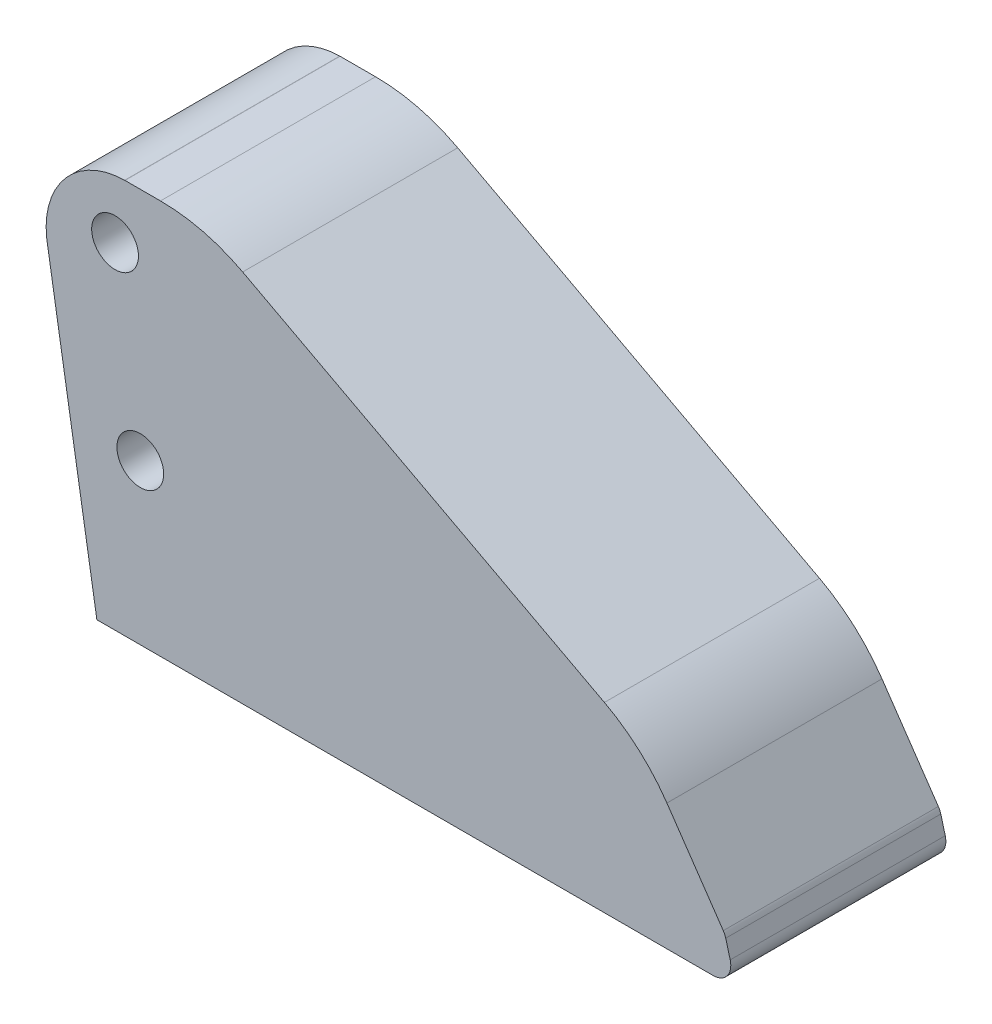
ISO-10303-21;
HEADER;
FILE_DESCRIPTION(('STEP AP214'),'2;1');
FILE_NAME('part.step','',(''),(''),'','','');
FILE_SCHEMA(('AUTOMOTIVE_DESIGN { 1 0 10303 214 1 1 1 1 }'));
ENDSEC;
DATA;
#1=APPLICATION_CONTEXT('core data for automotive mechanical design processes');
#2=APPLICATION_PROTOCOL_DEFINITION('international standard','automotive_design',2000,#1);
#3=PRODUCT_CONTEXT('',#1,'mechanical');
#4=PRODUCT('Part','Part','',(#3));
#5=PRODUCT_RELATED_PRODUCT_CATEGORY('part','',(#4));
#6=PRODUCT_DEFINITION_FORMATION('','',#4);
#7=PRODUCT_DEFINITION_CONTEXT('part definition',#1,'design');
#8=PRODUCT_DEFINITION('design','',#6,#7);
#9=PRODUCT_DEFINITION_SHAPE('','',#8);
#10=(LENGTH_UNIT() NAMED_UNIT(*) SI_UNIT(.MILLI.,.METRE.));
#11=(NAMED_UNIT(*) PLANE_ANGLE_UNIT() SI_UNIT($,.RADIAN.));
#12=(NAMED_UNIT(*) SI_UNIT($,.STERADIAN.) SOLID_ANGLE_UNIT());
#13=UNCERTAINTY_MEASURE_WITH_UNIT(LENGTH_MEASURE(1.E-05),#10,'distance_accuracy_value','');
#14=(GEOMETRIC_REPRESENTATION_CONTEXT(3) GLOBAL_UNCERTAINTY_ASSIGNED_CONTEXT((#13)) GLOBAL_UNIT_ASSIGNED_CONTEXT((#10,
#11,#12)) REPRESENTATION_CONTEXT('',''));
#15=CARTESIAN_POINT('',(0.,0.,0.));
#16=DIRECTION('',(0.,0.,1.));
#17=DIRECTION('',(1.,0.,0.));
#18=AXIS2_PLACEMENT_3D('',#15,#16,#17);
#19=CARTESIAN_POINT('',(14.7218848199657,32.6719265465916,31.28));
#20=DIRECTION('',(0.,0.,-1.));
#21=DIRECTION('',(-1.,0.,0.));
#22=AXIS2_PLACEMENT_3D('',#19,#20,#21);
#23=CYLINDRICAL_SURFACE('',#22,2.8);
#24=CARTESIAN_POINT('',(14.7218848199657,32.6719265465916,31.28));
#25=DIRECTION('',(0.,0.,1.));
#26=DIRECTION('',(1.,0.,0.));
#27=AXIS2_PLACEMENT_3D('',#24,#25,#26);
#28=CIRCLE('',#27,2.8);
#29=CARTESIAN_POINT('',(17.5218848199657,32.6719265465916,31.28));
#30=VERTEX_POINT('',#29);
#31=EDGE_CURVE('E459',#30,#30,#28,.T.);
#32=ORIENTED_EDGE('',*,*,#31,.T.);
#33=EDGE_LOOP('',(#32));
#34=FACE_BOUND('',#33,.T.);
#35=CARTESIAN_POINT('',(14.7218848199657,32.6719265465916,5.52));
#36=DIRECTION('',(0.,0.,1.));
#37=DIRECTION('',(1.,0.,0.));
#38=AXIS2_PLACEMENT_3D('',#35,#36,#37);
#39=CIRCLE('',#38,2.8);
#40=CARTESIAN_POINT('',(17.5218848199657,32.6719265465916,5.52));
#41=VERTEX_POINT('',#40);
#42=EDGE_CURVE('E391',#41,#41,#39,.T.);
#43=ORIENTED_EDGE('',*,*,#42,.F.);
#44=EDGE_LOOP('',(#43));
#45=FACE_BOUND('',#44,.T.);
#46=ADVANCED_FACE('F245',(#34,#45),#23,.F.);
#47=CARTESIAN_POINT('',(17.7452875456582,11.578018810813,31.28));
#48=DIRECTION('',(0.,0.,-1.));
#49=DIRECTION('',(-1.,0.,0.));
#50=AXIS2_PLACEMENT_3D('',#47,#48,#49);
#51=CYLINDRICAL_SURFACE('',#50,2.8);
#52=CARTESIAN_POINT('',(17.7452875456582,11.578018810813,31.28));
#53=DIRECTION('',(0.,0.,1.));
#54=DIRECTION('',(1.,0.,0.));
#55=AXIS2_PLACEMENT_3D('',#52,#53,#54);
#56=CIRCLE('',#55,2.8);
#57=CARTESIAN_POINT('',(20.5452875456582,11.578018810813,31.28));
#58=VERTEX_POINT('',#57);
#59=EDGE_CURVE('E382',#58,#58,#56,.T.);
#60=ORIENTED_EDGE('',*,*,#59,.T.);
#61=EDGE_LOOP('',(#60));
#62=FACE_BOUND('',#61,.T.);
#63=CARTESIAN_POINT('',(17.7452875456582,11.578018810813,5.52));
#64=DIRECTION('',(0.,0.,1.));
#65=DIRECTION('',(1.,0.,0.));
#66=AXIS2_PLACEMENT_3D('',#63,#64,#65);
#67=CIRCLE('',#66,2.8);
#68=CARTESIAN_POINT('',(20.5452875456582,11.578018810813,5.52));
#69=VERTEX_POINT('',#68);
#70=EDGE_CURVE('E498',#69,#69,#67,.T.);
#71=ORIENTED_EDGE('',*,*,#70,.F.);
#72=EDGE_LOOP('',(#71));
#73=FACE_BOUND('',#72,.T.);
#74=ADVANCED_FACE('F583',(#62,#73),#51,.F.);
#75=CARTESIAN_POINT('',(11.9580187732031,-7.53641545776768,31.28));
#76=DIRECTION('',(0.,-1.,0.));
#77=DIRECTION('',(1.,0.,0.));
#78=AXIS2_PLACEMENT_3D('',#75,#76,#77);
#79=PLANE('',#78);
#80=DIRECTION('',(-1.,0.,0.));
#81=VECTOR('',#80,1.);
#82=CARTESIAN_POINT('',(11.9580187732031,-7.53641545776768,5.52));
#83=LINE('',#82,#81);
#84=CARTESIAN_POINT('',(86.3726465055298,-7.53641545776772,5.52));
#85=VERTEX_POINT('',#84);
#86=CARTESIAN_POINT('',(12.5435447867304,-7.53641545776771,5.52));
#87=VERTEX_POINT('',#86);
#88=EDGE_CURVE('E427',#85,#87,#83,.T.);
#89=ORIENTED_EDGE('',*,*,#88,.F.);
#90=DIRECTION('',(0.,0.,-1.));
#91=VECTOR('',#90,1.);
#92=CARTESIAN_POINT('',(86.3726465055298,-7.53641545776772,31.28));
#93=LINE('',#92,#91);
#94=CARTESIAN_POINT('',(86.3726465055298,-7.53641545776772,31.28));
#95=VERTEX_POINT('',#94);
#96=EDGE_CURVE('E388',#95,#85,#93,.T.);
#97=ORIENTED_EDGE('',*,*,#96,.F.);
#98=DIRECTION('',(-1.,0.,0.));
#99=VECTOR('',#98,1.);
#100=CARTESIAN_POINT('',(11.9580187732031,-7.53641545776768,31.28));
#101=LINE('',#100,#99);
#102=CARTESIAN_POINT('',(12.5435447867304,-7.53641545776771,31.28));
#103=VERTEX_POINT('',#102);
#104=EDGE_CURVE('E375',#95,#103,#101,.T.);
#105=ORIENTED_EDGE('',*,*,#104,.T.);
#106=DIRECTION('',(0.,0.,1.));
#107=VECTOR('',#106,1.);
#108=CARTESIAN_POINT('',(12.5435447867304,-7.53641545776771,-71.939887575651));
#109=LINE('',#108,#107);
#110=EDGE_CURVE('E387',#87,#103,#109,.T.);
#111=ORIENTED_EDGE('',*,*,#110,.F.);
#112=EDGE_LOOP('',(#89,#97,#105,#111));
#113=FACE_BOUND('',#112,.T.);
#114=ADVANCED_FACE('F247',(#113),#79,.T.);
#115=CARTESIAN_POINT('',(86.3726465055298,-5.43641545776772,31.28));
#116=DIRECTION('',(0.,0.,-1.));
#117=DIRECTION('',(-1.,0.,0.));
#118=AXIS2_PLACEMENT_3D('',#115,#116,#117);
#119=CYLINDRICAL_SURFACE('',#118,2.1);
#120=CARTESIAN_POINT('',(86.3726465055298,-5.43641545776772,5.52));
#121=DIRECTION('',(0.,0.,1.));
#122=DIRECTION('',(1.,0.,0.));
#123=AXIS2_PLACEMENT_3D('',#120,#121,#122);
#124=CIRCLE('',#123,2.1);
#125=CARTESIAN_POINT('',(88.4001217851873,-4.88929208011139,5.52));
#126=VERTEX_POINT('',#125);
#127=EDGE_CURVE('E464',#126,#85,#124,.F.);
#128=ORIENTED_EDGE('',*,*,#127,.F.);
#129=DIRECTION('',(0.,0.,-1.));
#130=VECTOR('',#129,1.);
#131=CARTESIAN_POINT('',(88.4001217851873,-4.88929208011139,31.28));
#132=LINE('',#131,#130);
#133=CARTESIAN_POINT('',(88.4001217851873,-4.88929208011139,31.28));
#134=VERTEX_POINT('',#133);
#135=EDGE_CURVE('E522',#134,#126,#132,.T.);
#136=ORIENTED_EDGE('',*,*,#135,.F.);
#137=CARTESIAN_POINT('',(86.3726465055298,-5.43641545776772,31.28));
#138=DIRECTION('',(0.,0.,1.));
#139=DIRECTION('',(1.,0.,0.));
#140=AXIS2_PLACEMENT_3D('',#137,#138,#139);
#141=CIRCLE('',#140,2.1);
#142=EDGE_CURVE('E390',#134,#95,#141,.F.);
#143=ORIENTED_EDGE('',*,*,#142,.T.);
#144=ORIENTED_EDGE('',*,*,#96,.T.);
#145=EDGE_LOOP('',(#128,#136,#143,#144));
#146=FACE_BOUND('',#145,.T.);
#147=ADVANCED_FACE('F582',(#146),#119,.T.);
#148=CARTESIAN_POINT('',(80.7527995598215,23.4493923934351,31.28));
#149=DIRECTION('',(-0.965464418884485,-0.26053494174111,0.));
#150=DIRECTION('',(0.26053494174111,-0.965464418884485,0.));
#151=AXIS2_PLACEMENT_3D('',#148,#149,#150);
#152=PLANE('',#151);
#153=DIRECTION('',(-0.26053494174111,0.965464418884485,0.));
#154=VECTOR('',#153,1.);
#155=CARTESIAN_POINT('',(80.7527995598215,23.4493923934351,5.52));
#156=LINE('',#155,#154);
#157=CARTESIAN_POINT('',(87.8657646196762,-2.90912455697932,5.52));
#158=VERTEX_POINT('',#157);
#159=EDGE_CURVE('E467',#126,#158,#156,.T.);
#160=ORIENTED_EDGE('',*,*,#159,.T.);
#161=DIRECTION('',(0.,0.,-1.));
#162=VECTOR('',#161,1.);
#163=CARTESIAN_POINT('',(87.8657646196762,-2.90912455697932,31.28));
#164=LINE('',#163,#162);
#165=CARTESIAN_POINT('',(87.8657646196762,-2.90912455697932,31.28));
#166=VERTEX_POINT('',#165);
#167=EDGE_CURVE('E520',#166,#158,#164,.T.);
#168=ORIENTED_EDGE('',*,*,#167,.F.);
#169=DIRECTION('',(-0.26053494174111,0.965464418884485,0.));
#170=VECTOR('',#169,1.);
#171=CARTESIAN_POINT('',(80.7527995598215,23.4493923934351,31.28));
#172=LINE('',#171,#170);
#173=EDGE_CURVE('E430',#134,#166,#172,.T.);
#174=ORIENTED_EDGE('',*,*,#173,.F.);
#175=ORIENTED_EDGE('',*,*,#135,.T.);
#176=EDGE_LOOP('',(#160,#168,#174,#175));
#177=FACE_BOUND('',#176,.T.);
#178=ADVANCED_FACE('F804',(#177),#152,.F.);
#179=CARTESIAN_POINT('',(85.8382893400188,-3.45624793463564,31.28));
#180=DIRECTION('',(0.,0.,-1.));
#181=DIRECTION('',(-1.,0.,0.));
#182=AXIS2_PLACEMENT_3D('',#179,#180,#181);
#183=CYLINDRICAL_SURFACE('',#182,2.09999999999999);
#184=CARTESIAN_POINT('',(85.8382893400188,-3.45624793463564,5.52));
#185=DIRECTION('',(0.,0.,1.));
#186=DIRECTION('',(1.,0.,0.));
#187=AXIS2_PLACEMENT_3D('',#184,#185,#186);
#188=CIRCLE('',#187,2.09999999999999);
#189=CARTESIAN_POINT('',(87.5713108540244,-2.27023088922955,5.52));
#190=VERTEX_POINT('',#189);
#191=EDGE_CURVE('E470',#190,#158,#188,.F.);
#192=ORIENTED_EDGE('',*,*,#191,.F.);
#193=DIRECTION('',(0.,0.,-1.));
#194=VECTOR('',#193,1.);
#195=CARTESIAN_POINT('',(87.5713108540244,-2.27023088922955,31.28));
#196=LINE('',#195,#194);
#197=CARTESIAN_POINT('',(87.5713108540244,-2.27023088922955,31.28));
#198=VERTEX_POINT('',#197);
#199=EDGE_CURVE('E518',#198,#190,#196,.T.);
#200=ORIENTED_EDGE('',*,*,#199,.F.);
#201=CARTESIAN_POINT('',(85.8382893400188,-3.45624793463564,31.28));
#202=DIRECTION('',(0.,0.,1.));
#203=DIRECTION('',(1.,0.,0.));
#204=AXIS2_PLACEMENT_3D('',#201,#202,#203);
#205=CIRCLE('',#204,2.09999999999999);
#206=EDGE_CURVE('E432',#198,#166,#205,.F.);
#207=ORIENTED_EDGE('',*,*,#206,.T.);
#208=ORIENTED_EDGE('',*,*,#167,.T.);
#209=EDGE_LOOP('',(#192,#200,#207,#208));
#210=FACE_BOUND('',#209,.T.);
#211=ADVANCED_FACE('F815',(#210),#183,.T.);
#212=CARTESIAN_POINT('',(60.1185145324188,37.844105434382,31.28));
#213=DIRECTION('',(0.82524834000266,0.564770021621947,0.));
#214=DIRECTION('',(-0.564770021621947,0.82524834000266,0.));
#215=AXIS2_PLACEMENT_3D('',#212,#213,#214);
#216=PLANE('',#215);
#217=DIRECTION('',(0.564770021621947,-0.82524834000266,0.));
#218=VECTOR('',#217,1.);
#219=CARTESIAN_POINT('',(60.1185145324188,37.844105434382,5.52));
#220=LINE('',#219,#218);
#221=CARTESIAN_POINT('',(80.8228738656638,7.59066152546222,5.52));
#222=VERTEX_POINT('',#221);
#223=EDGE_CURVE('E473',#222,#190,#220,.T.);
#224=ORIENTED_EDGE('',*,*,#223,.F.);
#225=DIRECTION('',(0.,0.,-1.));
#226=VECTOR('',#225,1.);
#227=CARTESIAN_POINT('',(80.8228738656638,7.59066152546222,31.28));
#228=LINE('',#227,#226);
#229=CARTESIAN_POINT('',(80.8228738656638,7.59066152546222,31.28));
#230=VERTEX_POINT('',#229);
#231=EDGE_CURVE('E516',#230,#222,#228,.T.);
#232=ORIENTED_EDGE('',*,*,#231,.F.);
#233=DIRECTION('',(0.564770021621947,-0.82524834000266,0.));
#234=VECTOR('',#233,1.);
#235=CARTESIAN_POINT('',(60.1185145324188,37.844105434382,31.28));
#236=LINE('',#235,#234);
#237=EDGE_CURVE('E435',#230,#198,#236,.T.);
#238=ORIENTED_EDGE('',*,*,#237,.T.);
#239=ORIENTED_EDGE('',*,*,#199,.T.);
#240=EDGE_LOOP('',(#224,#232,#238,#239));
#241=FACE_BOUND('',#240,.T.);
#242=ADVANCED_FACE('F825',(#241),#216,.T.);
#243=CARTESIAN_POINT('',(63.4926587256079,-4.26950892859867,31.28));
#244=DIRECTION('',(0.,0.,-1.));
#245=DIRECTION('',(-1.,0.,0.));
#246=AXIS2_PLACEMENT_3D('',#243,#244,#245);
#247=CYLINDRICAL_SURFACE('',#246,21.);
#248=CARTESIAN_POINT('',(63.4926587256079,-4.26950892859867,5.52));
#249=DIRECTION('',(0.,0.,1.));
#250=DIRECTION('',(1.,0.,0.));
#251=AXIS2_PLACEMENT_3D('',#248,#249,#250);
#252=CIRCLE('',#251,21.);
#253=CARTESIAN_POINT('',(73.3343966680821,14.2815070616824,5.52));
#254=VERTEX_POINT('',#253);
#255=EDGE_CURVE('E476',#254,#222,#252,.F.);
#256=ORIENTED_EDGE('',*,*,#255,.F.);
#257=DIRECTION('',(0.,0.,-1.));
#258=VECTOR('',#257,1.);
#259=CARTESIAN_POINT('',(73.3343966680821,14.2815070616824,31.28));
#260=LINE('',#259,#258);
#261=CARTESIAN_POINT('',(73.3343966680821,14.2815070616824,31.28));
#262=VERTEX_POINT('',#261);
#263=EDGE_CURVE('E514',#262,#254,#260,.T.);
#264=ORIENTED_EDGE('',*,*,#263,.F.);
#265=CARTESIAN_POINT('',(63.4926587256079,-4.26950892859867,31.28));
#266=DIRECTION('',(0.,0.,1.));
#267=DIRECTION('',(1.,0.,0.));
#268=AXIS2_PLACEMENT_3D('',#265,#266,#267);
#269=CIRCLE('',#268,21.);
#270=EDGE_CURVE('E438',#262,#230,#269,.F.);
#271=ORIENTED_EDGE('',*,*,#270,.T.);
#272=ORIENTED_EDGE('',*,*,#231,.T.);
#273=EDGE_LOOP('',(#256,#264,#271,#272));
#274=FACE_BOUND('',#273,.T.);
#275=ADVANCED_FACE('F835',(#274),#247,.T.);
#276=CARTESIAN_POINT('',(29.3287646460027,37.6275005415626,31.28));
#277=DIRECTION('',(0.468654187736866,0.883381713822908,0.));
#278=DIRECTION('',(-0.883381713822908,0.468654187736866,0.));
#279=AXIS2_PLACEMENT_3D('',#276,#277,#278);
#280=PLANE('',#279);
#281=DIRECTION('',(0.883381713822908,-0.468654187736866,0.));
#282=VECTOR('',#281,1.);
#283=CARTESIAN_POINT('',(29.3287646460027,37.6275005415626,5.52));
#284=LINE('',#283,#282);
#285=CARTESIAN_POINT('',(30.0054069867823,37.268526315988,5.52));
#286=VERTEX_POINT('',#285);
#287=EDGE_CURVE('E479',#286,#254,#284,.T.);
#288=ORIENTED_EDGE('',*,*,#287,.F.);
#289=DIRECTION('',(0.,0.,-1.));
#290=VECTOR('',#289,1.);
#291=CARTESIAN_POINT('',(30.0054069867823,37.268526315988,31.28));
#292=LINE('',#291,#290);
#293=CARTESIAN_POINT('',(30.0054069867823,37.268526315988,31.28));
#294=VERTEX_POINT('',#293);
#295=EDGE_CURVE('E512',#294,#286,#292,.T.);
#296=ORIENTED_EDGE('',*,*,#295,.F.);
#297=DIRECTION('',(0.883381713822908,-0.468654187736866,0.));
#298=VECTOR('',#297,1.);
#299=CARTESIAN_POINT('',(29.3287646460027,37.6275005415626,31.28));
#300=LINE('',#299,#298);
#301=EDGE_CURVE('E441',#294,#262,#300,.T.);
#302=ORIENTED_EDGE('',*,*,#301,.T.);
#303=ORIENTED_EDGE('',*,*,#263,.T.);
#304=EDGE_LOOP('',(#288,#296,#302,#303));
#305=FACE_BOUND('',#304,.T.);
#306=ADVANCED_FACE('F845',(#305),#280,.T.);
#307=CARTESIAN_POINT('',(20.1636690443081,18.7175103257069,31.28));
#308=DIRECTION('',(0.,0.,-1.));
#309=DIRECTION('',(-1.,0.,0.));
#310=AXIS2_PLACEMENT_3D('',#307,#308,#309);
#311=CYLINDRICAL_SURFACE('',#310,21.);
#312=CARTESIAN_POINT('',(20.1636690443081,18.7175103257069,5.52));
#313=DIRECTION('',(0.,0.,1.));
#314=DIRECTION('',(1.,0.,0.));
#315=AXIS2_PLACEMENT_3D('',#312,#313,#314);
#316=CIRCLE('',#315,21.);
#317=CARTESIAN_POINT('',(20.1636690443081,39.7175103257069,5.52));
#318=VERTEX_POINT('',#317);
#319=EDGE_CURVE('E482',#318,#286,#316,.F.);
#320=ORIENTED_EDGE('',*,*,#319,.F.);
#321=DIRECTION('',(0.,0.,-1.));
#322=VECTOR('',#321,1.);
#323=CARTESIAN_POINT('',(20.1636690443081,39.7175103257069,31.28));
#324=LINE('',#323,#322);
#325=CARTESIAN_POINT('',(20.1636690443081,39.7175103257069,31.28));
#326=VERTEX_POINT('',#325);
#327=EDGE_CURVE('E510',#326,#318,#324,.T.);
#328=ORIENTED_EDGE('',*,*,#327,.F.);
#329=CARTESIAN_POINT('',(20.1636690443081,18.7175103257069,31.28));
#330=DIRECTION('',(0.,0.,1.));
#331=DIRECTION('',(1.,0.,0.));
#332=AXIS2_PLACEMENT_3D('',#329,#330,#331);
#333=CIRCLE('',#332,21.);
#334=EDGE_CURVE('E444',#326,#294,#333,.F.);
#335=ORIENTED_EDGE('',*,*,#334,.T.);
#336=ORIENTED_EDGE('',*,*,#295,.T.);
#337=EDGE_LOOP('',(#320,#328,#335,#336));
#338=FACE_BOUND('',#337,.T.);
#339=ADVANCED_FACE('F855',(#338),#311,.T.);
#340=CARTESIAN_POINT('',(11.9580187732031,39.7175103257069,31.28));
#341=DIRECTION('',(0.,1.,0.));
#342=DIRECTION('',(-1.,0.,0.));
#343=AXIS2_PLACEMENT_3D('',#340,#341,#342);
#344=PLANE('',#343);
#345=DIRECTION('',(1.,0.,0.));
#346=VECTOR('',#345,1.);
#347=CARTESIAN_POINT('',(11.9580187732031,39.7175103257069,5.52));
#348=LINE('',#347,#346);
#349=CARTESIAN_POINT('',(15.9076690443081,39.7175103257069,5.52));
#350=VERTEX_POINT('',#349);
#351=EDGE_CURVE('E485',#350,#318,#348,.T.);
#352=ORIENTED_EDGE('',*,*,#351,.F.);
#353=DIRECTION('',(0.,0.,-1.));
#354=VECTOR('',#353,1.);
#355=CARTESIAN_POINT('',(15.9076690443081,39.7175103257069,31.28));
#356=LINE('',#355,#354);
#357=CARTESIAN_POINT('',(15.9076690443081,39.7175103257069,31.28));
#358=VERTEX_POINT('',#357);
#359=EDGE_CURVE('E508',#358,#350,#356,.T.);
#360=ORIENTED_EDGE('',*,*,#359,.F.);
#361=DIRECTION('',(1.,0.,0.));
#362=VECTOR('',#361,1.);
#363=CARTESIAN_POINT('',(11.9580187732031,39.7175103257069,31.28));
#364=LINE('',#363,#362);
#365=EDGE_CURVE('E447',#358,#326,#364,.T.);
#366=ORIENTED_EDGE('',*,*,#365,.T.);
#367=ORIENTED_EDGE('',*,*,#327,.T.);
#368=EDGE_LOOP('',(#352,#360,#366,#367));
#369=FACE_BOUND('',#368,.T.);
#370=ADVANCED_FACE('F865',(#369),#344,.T.);
#371=CARTESIAN_POINT('',(15.9076690443081,37.6175103257069,31.28));
#372=DIRECTION('',(0.,0.,-1.));
#373=DIRECTION('',(-1.,0.,0.));
#374=AXIS2_PLACEMENT_3D('',#371,#372,#373);
#375=CYLINDRICAL_SURFACE('',#374,2.1);
#376=CARTESIAN_POINT('',(15.9076690443081,37.6175103257069,5.52));
#377=DIRECTION('',(0.,0.,1.));
#378=DIRECTION('',(1.,0.,0.));
#379=AXIS2_PLACEMENT_3D('',#376,#377,#378);
#380=CIRCLE('',#379,2.1);
#381=CARTESIAN_POINT('',(15.8715621396759,39.7171998959619,5.52));
#382=VERTEX_POINT('',#381);
#383=EDGE_CURVE('E488',#382,#350,#380,.F.);
#384=ORIENTED_EDGE('',*,*,#383,.F.);
#385=DIRECTION('',(0.,0.,-1.));
#386=VECTOR('',#385,1.);
#387=CARTESIAN_POINT('',(15.8715621396759,39.7171998959619,31.28));
#388=LINE('',#387,#386);
#389=CARTESIAN_POINT('',(15.8715621396759,39.7171998959619,31.28));
#390=VERTEX_POINT('',#389);
#391=EDGE_CURVE('E506',#390,#382,#388,.T.);
#392=ORIENTED_EDGE('',*,*,#391,.F.);
#393=CARTESIAN_POINT('',(15.9076690443081,37.6175103257069,31.28));
#394=DIRECTION('',(0.,0.,1.));
#395=DIRECTION('',(1.,0.,0.));
#396=AXIS2_PLACEMENT_3D('',#393,#394,#395);
#397=CIRCLE('',#396,2.1);
#398=EDGE_CURVE('E450',#390,#358,#397,.F.);
#399=ORIENTED_EDGE('',*,*,#398,.T.);
#400=ORIENTED_EDGE('',*,*,#359,.T.);
#401=EDGE_LOOP('',(#384,#392,#399,#400));
#402=FACE_BOUND('',#401,.T.);
#403=ADVANCED_FACE('F875',(#402),#375,.T.);
#404=CARTESIAN_POINT('',(16.0360892684499,30.149614420833,31.28));
#405=DIRECTION('',(0.,0.,-1.));
#406=DIRECTION('',(-1.,0.,0.));
#407=AXIS2_PLACEMENT_3D('',#404,#405,#406);
#408=CYLINDRICAL_SURFACE('',#407,9.569);
#409=CARTESIAN_POINT('',(16.0360892684499,30.149614420833,5.52));
#410=DIRECTION('',(0.,0.,1.));
#411=DIRECTION('',(1.,0.,0.));
#412=AXIS2_PLACEMENT_3D('',#409,#410,#411);
#413=CIRCLE('',#412,9.569);
#414=CARTESIAN_POINT('',(6.52567188076961,29.092390645037,5.52));
#415=VERTEX_POINT('',#414);
#416=EDGE_CURVE('E491',#415,#382,#413,.F.);
#417=ORIENTED_EDGE('',*,*,#416,.F.);
#418=DIRECTION('',(0.,0.,-1.));
#419=VECTOR('',#418,1.);
#420=CARTESIAN_POINT('',(6.52567188076961,29.092390645037,31.28));
#421=LINE('',#420,#419);
#422=CARTESIAN_POINT('',(6.52567188076961,29.092390645037,31.28));
#423=VERTEX_POINT('',#422);
#424=EDGE_CURVE('E504',#423,#415,#421,.T.);
#425=ORIENTED_EDGE('',*,*,#424,.F.);
#426=CARTESIAN_POINT('',(16.0360892684499,30.149614420833,31.28));
#427=DIRECTION('',(0.,0.,1.));
#428=DIRECTION('',(1.,0.,0.));
#429=AXIS2_PLACEMENT_3D('',#426,#427,#428);
#430=CIRCLE('',#429,9.569);
#431=EDGE_CURVE('E453',#423,#390,#430,.F.);
#432=ORIENTED_EDGE('',*,*,#431,.T.);
#433=ORIENTED_EDGE('',*,*,#391,.T.);
#434=EDGE_LOOP('',(#417,#425,#432,#433));
#435=FACE_BOUND('',#434,.T.);
#436=ADVANCED_FACE('F885',(#435),#408,.T.);
#437=CARTESIAN_POINT('',(8.6128154186658,29.3244075673038,31.28));
#438=DIRECTION('',(0.,0.,-1.));
#439=DIRECTION('',(-1.,0.,0.));
#440=AXIS2_PLACEMENT_3D('',#437,#438,#439);
#441=CYLINDRICAL_SURFACE('',#440,2.1);
#442=CARTESIAN_POINT('',(8.6128154186658,29.3244075673038,5.52));
#443=DIRECTION('',(0.,0.,1.));
#444=DIRECTION('',(1.,0.,0.));
#445=AXIS2_PLACEMENT_3D('',#442,#443,#444);
#446=CIRCLE('',#445,2.1);
#447=CARTESIAN_POINT('',(6.54062246649562,28.9837958103484,5.52));
#448=VERTEX_POINT('',#447);
#449=EDGE_CURVE('E494',#448,#415,#446,.F.);
#450=ORIENTED_EDGE('',*,*,#449,.F.);
#451=DIRECTION('',(0.,0.,-1.));
#452=VECTOR('',#451,1.);
#453=CARTESIAN_POINT('',(6.54062246649562,28.9837958103484,31.28));
#454=LINE('',#453,#452);
#455=CARTESIAN_POINT('',(6.54062246649562,28.9837958103484,31.28));
#456=VERTEX_POINT('',#455);
#457=EDGE_CURVE('E462',#456,#448,#454,.T.);
#458=ORIENTED_EDGE('',*,*,#457,.F.);
#459=CARTESIAN_POINT('',(8.6128154186658,29.3244075673038,31.28));
#460=DIRECTION('',(0.,0.,1.));
#461=DIRECTION('',(1.,0.,0.));
#462=AXIS2_PLACEMENT_3D('',#459,#460,#461);
#463=CIRCLE('',#462,2.1);
#464=EDGE_CURVE('E379',#456,#423,#463,.F.);
#465=ORIENTED_EDGE('',*,*,#464,.T.);
#466=ORIENTED_EDGE('',*,*,#424,.T.);
#467=EDGE_LOOP('',(#450,#458,#465,#466));
#468=FACE_BOUND('',#467,.T.);
#469=ADVANCED_FACE('F574',(#468),#441,.T.);
#470=CARTESIAN_POINT('',(10.5401442922329,4.65174980751901,31.28));
#471=DIRECTION('',(-0.986758548652465,-0.162196074740669,0.));
#472=DIRECTION('',(0.162196074740669,-0.986758548652465,0.));
#473=AXIS2_PLACEMENT_3D('',#470,#471,#472);
#474=PLANE('',#473);
#475=DIRECTION('',(-0.162196074740669,0.986758548652465,0.));
#476=VECTOR('',#475,1.);
#477=CARTESIAN_POINT('',(10.5401442922329,4.65174980751901,5.52));
#478=LINE('',#477,#476);
#479=EDGE_CURVE('E395',#87,#448,#478,.T.);
#480=ORIENTED_EDGE('',*,*,#479,.F.);
#481=ORIENTED_EDGE('',*,*,#110,.T.);
#482=DIRECTION('',(-0.162196074740669,0.986758548652465,0.));
#483=VECTOR('',#482,1.);
#484=CARTESIAN_POINT('',(10.5401442922329,4.65174980751901,31.28));
#485=LINE('',#484,#483);
#486=EDGE_CURVE('E370',#103,#456,#485,.T.);
#487=ORIENTED_EDGE('',*,*,#486,.T.);
#488=ORIENTED_EDGE('',*,*,#457,.T.);
#489=EDGE_LOOP('',(#480,#481,#487,#488));
#490=FACE_BOUND('',#489,.T.);
#491=ADVANCED_FACE('F393',(#490),#474,.T.);
#492=CARTESIAN_POINT('',(11.9580187732031,4.88480953180759,5.52));
#493=DIRECTION('',(0.,0.,1.));
#494=DIRECTION('',(1.,0.,0.));
#495=AXIS2_PLACEMENT_3D('',#492,#493,#494);
#496=PLANE('',#495);
#497=ORIENTED_EDGE('',*,*,#88,.T.);
#498=ORIENTED_EDGE('',*,*,#479,.T.);
#499=ORIENTED_EDGE('',*,*,#449,.T.);
#500=ORIENTED_EDGE('',*,*,#416,.T.);
#501=ORIENTED_EDGE('',*,*,#383,.T.);
#502=ORIENTED_EDGE('',*,*,#351,.T.);
#503=ORIENTED_EDGE('',*,*,#319,.T.);
#504=ORIENTED_EDGE('',*,*,#287,.T.);
#505=ORIENTED_EDGE('',*,*,#255,.T.);
#506=ORIENTED_EDGE('',*,*,#223,.T.);
#507=ORIENTED_EDGE('',*,*,#191,.T.);
#508=ORIENTED_EDGE('',*,*,#159,.F.);
#509=ORIENTED_EDGE('',*,*,#127,.T.);
#510=EDGE_LOOP('',(#497,#498,#499,#500,#501,#502,#503,#504,#505,#506,#507,#508,#509));
#511=FACE_BOUND('',#510,.T.);
#512=ORIENTED_EDGE('',*,*,#70,.T.);
#513=EDGE_LOOP('',(#512));
#514=FACE_BOUND('',#513,.T.);
#515=ORIENTED_EDGE('',*,*,#42,.T.);
#516=EDGE_LOOP('',(#515));
#517=FACE_BOUND('',#516,.T.);
#518=ADVANCED_FACE('F592',(#511,#514,#517),#496,.F.);
#519=CARTESIAN_POINT('',(11.9580187732031,4.88480953180759,31.28));
#520=DIRECTION('',(0.,0.,1.));
#521=DIRECTION('',(1.,0.,0.));
#522=AXIS2_PLACEMENT_3D('',#519,#520,#521);
#523=PLANE('',#522);
#524=ORIENTED_EDGE('',*,*,#486,.F.);
#525=ORIENTED_EDGE('',*,*,#104,.F.);
#526=ORIENTED_EDGE('',*,*,#142,.F.);
#527=ORIENTED_EDGE('',*,*,#173,.T.);
#528=ORIENTED_EDGE('',*,*,#206,.F.);
#529=ORIENTED_EDGE('',*,*,#237,.F.);
#530=ORIENTED_EDGE('',*,*,#270,.F.);
#531=ORIENTED_EDGE('',*,*,#301,.F.);
#532=ORIENTED_EDGE('',*,*,#334,.F.);
#533=ORIENTED_EDGE('',*,*,#365,.F.);
#534=ORIENTED_EDGE('',*,*,#398,.F.);
#535=ORIENTED_EDGE('',*,*,#431,.F.);
#536=ORIENTED_EDGE('',*,*,#464,.F.);
#537=EDGE_LOOP('',(#524,#525,#526,#527,#528,#529,#530,#531,#532,#533,#534,#535,#536));
#538=FACE_BOUND('',#537,.T.);
#539=ORIENTED_EDGE('',*,*,#59,.F.);
#540=EDGE_LOOP('',(#539));
#541=FACE_BOUND('',#540,.T.);
#542=ORIENTED_EDGE('',*,*,#31,.F.);
#543=EDGE_LOOP('',(#542));
#544=FACE_BOUND('',#543,.T.);
#545=ADVANCED_FACE('F372',(#538,#541,#544),#523,.T.);
#546=CLOSED_SHELL('',(#46,#74,#114,#147,#178,#211,#242,#275,#306,#339,#370,#403,#436,#469,#491,
#518,#545));
#547=CARTESIAN_POINT('',(86.3726465055298,-6.95023436823661,-71.939887575651));
#548=DIRECTION('',(0.468857926821176,0.883273595471386,0.));
#549=DIRECTION('',(-0.883273595471386,0.468857926821176,0.));
#550=AXIS2_PLACEMENT_3D('',#547,#548,#549);
#551=PLANE('',#550);
#552=DIRECTION('',(0.,0.,1.));
#553=VECTOR('',#552,1.);
#554=CARTESIAN_POINT('',(60.8118154102169,6.61792654659165,-71.939887575651));
#555=LINE('',#554,#553);
#556=CARTESIAN_POINT('',(60.8118154102169,6.61792654659165,9.02));
#557=VERTEX_POINT('',#556);
#558=CARTESIAN_POINT('',(60.8118154102168,6.61792654659166,27.78));
#559=VERTEX_POINT('',#558);
#560=EDGE_CURVE('E397',#557,#559,#555,.T.);
#561=ORIENTED_EDGE('',*,*,#560,.T.);
#562=DIRECTION('',(0.883273595471386,-0.468857926821176,0.));
#563=VECTOR('',#562,1.);
#564=CARTESIAN_POINT('',(21.9657202930513,27.2381508067909,27.78));
#565=LINE('',#564,#563);
#566=CARTESIAN_POINT('',(72.4708053804332,0.429119483535249,27.78));
#567=VERTEX_POINT('',#566);
#568=EDGE_CURVE('E261',#559,#567,#565,.T.);
#569=ORIENTED_EDGE('',*,*,#568,.T.);
#570=DIRECTION('',(0.,0.,-1.));
#571=VECTOR('',#570,1.);
#572=CARTESIAN_POINT('',(72.4708053804332,0.429119483535245,5.52));
#573=LINE('',#572,#571);
#574=CARTESIAN_POINT('',(72.4708053804333,0.429119483535237,9.02));
#575=VERTEX_POINT('',#574);
#576=EDGE_CURVE('E400',#567,#575,#573,.T.);
#577=ORIENTED_EDGE('',*,*,#576,.T.);
#578=DIRECTION('',(-0.883273595471386,0.468857926821176,0.));
#579=VECTOR('',#578,1.);
#580=CARTESIAN_POINT('',(21.9657202930513,27.2381508067909,9.02));
#581=LINE('',#580,#579);
#582=EDGE_CURVE('E254',#575,#557,#581,.T.);
#583=ORIENTED_EDGE('',*,*,#582,.T.);
#584=EDGE_LOOP('',(#561,#569,#577,#583));
#585=FACE_BOUND('',#584,.T.);
#586=ADVANCED_FACE('F527',(#585),#551,.T.);
#587=CARTESIAN_POINT('',(60.8118154102169,6.61792654659165,-71.939887575651));
#588=DIRECTION('',(0.,1.,0.));
#589=DIRECTION('',(0.,0.,1.));
#590=AXIS2_PLACEMENT_3D('',#587,#588,#589);
#591=PLANE('',#590);
#592=DIRECTION('',(0.,0.,-1.));
#593=VECTOR('',#592,1.);
#594=CARTESIAN_POINT('',(49.0536224997259,6.61792654659165,5.52));
#595=LINE('',#594,#593);
#596=CARTESIAN_POINT('',(49.0536224997259,6.61792654659166,27.78));
#597=VERTEX_POINT('',#596);
#598=CARTESIAN_POINT('',(49.0536224997259,6.61792654659166,9.02));
#599=VERTEX_POINT('',#598);
#600=EDGE_CURVE('E406',#597,#599,#595,.T.);
#601=ORIENTED_EDGE('',*,*,#600,.F.);
#602=DIRECTION('',(1.,0.,0.));
#603=VECTOR('',#602,1.);
#604=CARTESIAN_POINT('',(11.9580187732031,6.61792654659165,27.78));
#605=LINE('',#604,#603);
#606=EDGE_CURVE('E265',#597,#559,#605,.T.);
#607=ORIENTED_EDGE('',*,*,#606,.T.);
#608=ORIENTED_EDGE('',*,*,#560,.F.);
#609=DIRECTION('',(-1.,0.,0.));
#610=VECTOR('',#609,1.);
#611=CARTESIAN_POINT('',(11.9580187732031,6.61792654659165,9.02));
#612=LINE('',#611,#610);
#613=EDGE_CURVE('E12',#557,#599,#612,.T.);
#614=ORIENTED_EDGE('',*,*,#613,.T.);
#615=EDGE_LOOP('',(#601,#607,#608,#614));
#616=FACE_BOUND('',#615,.T.);
#617=ADVANCED_FACE('F532',(#616),#591,.T.);
#618=CARTESIAN_POINT('',(11.9580187732031,8.38480953180758,5.52));
#619=DIRECTION('',(0.,1.,0.));
#620=DIRECTION('',(0.,0.,1.));
#621=AXIS2_PLACEMENT_3D('',#618,#619,#620);
#622=PLANE('',#621);
#623=DIRECTION('',(0.,0.,-1.));
#624=VECTOR('',#623,1.);
#625=CARTESIAN_POINT('',(49.0536224997259,8.38480953180758,5.52));
#626=LINE('',#625,#624);
#627=CARTESIAN_POINT('',(49.0536224997259,8.38480953180758,27.78));
#628=VERTEX_POINT('',#627);
#629=CARTESIAN_POINT('',(49.0536224997259,8.38480953180758,9.02));
#630=VERTEX_POINT('',#629);
#631=EDGE_CURVE('E409',#628,#630,#626,.T.);
#632=ORIENTED_EDGE('',*,*,#631,.T.);
#633=DIRECTION('',(-1.,0.,0.));
#634=VECTOR('',#633,1.);
#635=CARTESIAN_POINT('',(11.9580187732031,8.38480953180758,9.02));
#636=LINE('',#635,#634);
#637=CARTESIAN_POINT('',(72.4708053804332,8.38480953180758,9.02));
#638=VERTEX_POINT('',#637);
#639=EDGE_CURVE('E416',#638,#630,#636,.T.);
#640=ORIENTED_EDGE('',*,*,#639,.F.);
#641=DIRECTION('',(0.,0.,-1.));
#642=VECTOR('',#641,1.);
#643=CARTESIAN_POINT('',(72.4708053804332,8.38480953180758,5.52));
#644=LINE('',#643,#642);
#645=CARTESIAN_POINT('',(72.4708053804332,8.38480953180758,27.78));
#646=VERTEX_POINT('',#645);
#647=EDGE_CURVE('E414',#646,#638,#644,.T.);
#648=ORIENTED_EDGE('',*,*,#647,.F.);
#649=DIRECTION('',(1.,0.,0.));
#650=VECTOR('',#649,1.);
#651=CARTESIAN_POINT('',(11.9580187732031,8.38480953180758,27.78));
#652=LINE('',#651,#650);
#653=EDGE_CURVE('E412',#628,#646,#652,.T.);
#654=ORIENTED_EDGE('',*,*,#653,.F.);
#655=EDGE_LOOP('',(#632,#640,#648,#654));
#656=FACE_BOUND('',#655,.T.);
#657=ADVANCED_FACE('F541',(#656),#622,.F.);
#658=CARTESIAN_POINT('',(11.9580187732031,8.38480953180758,9.02));
#659=DIRECTION('',(0.,0.,1.));
#660=DIRECTION('',(1.,0.,0.));
#661=AXIS2_PLACEMENT_3D('',#658,#659,#660);
#662=PLANE('',#661);
#663=ORIENTED_EDGE('',*,*,#613,.F.);
#664=ORIENTED_EDGE('',*,*,#582,.F.);
#665=DIRECTION('',(0.,-1.,0.));
#666=VECTOR('',#665,1.);
#667=CARTESIAN_POINT('',(72.4708053804332,8.38480953180758,9.02));
#668=LINE('',#667,#666);
#669=EDGE_CURVE('E421',#638,#575,#668,.T.);
#670=ORIENTED_EDGE('',*,*,#669,.F.);
#671=ORIENTED_EDGE('',*,*,#639,.T.);
#672=DIRECTION('',(0.,-1.,0.));
#673=VECTOR('',#672,1.);
#674=CARTESIAN_POINT('',(49.0536224997259,8.38480953180758,9.02));
#675=LINE('',#674,#673);
#676=EDGE_CURVE('E418',#630,#599,#675,.T.);
#677=ORIENTED_EDGE('',*,*,#676,.T.);
#678=EDGE_LOOP('',(#663,#664,#670,#671,#677));
#679=FACE_BOUND('',#678,.T.);
#680=ADVANCED_FACE('F537',(#679),#662,.T.);
#681=CARTESIAN_POINT('',(72.4708053804332,8.38480953180758,5.52));
#682=DIRECTION('',(-1.,0.,0.));
#683=DIRECTION('',(0.,0.,1.));
#684=AXIS2_PLACEMENT_3D('',#681,#682,#683);
#685=PLANE('',#684);
#686=ORIENTED_EDGE('',*,*,#576,.F.);
#687=DIRECTION('',(0.,-1.,0.));
#688=VECTOR('',#687,1.);
#689=CARTESIAN_POINT('',(72.4708053804332,8.38480953180758,27.78));
#690=LINE('',#689,#688);
#691=EDGE_CURVE('E424',#646,#567,#690,.T.);
#692=ORIENTED_EDGE('',*,*,#691,.F.);
#693=ORIENTED_EDGE('',*,*,#647,.T.);
#694=ORIENTED_EDGE('',*,*,#669,.T.);
#695=EDGE_LOOP('',(#686,#692,#693,#694));
#696=FACE_BOUND('',#695,.T.);
#697=ADVANCED_FACE('F546',(#696),#685,.T.);
#698=CARTESIAN_POINT('',(11.9580187732031,8.38480953180758,27.78));
#699=DIRECTION('',(0.,0.,-1.));
#700=DIRECTION('',(-1.,0.,0.));
#701=AXIS2_PLACEMENT_3D('',#698,#699,#700);
#702=PLANE('',#701);
#703=ORIENTED_EDGE('',*,*,#606,.F.);
#704=DIRECTION('',(0.,-1.,0.));
#705=VECTOR('',#704,1.);
#706=CARTESIAN_POINT('',(49.0536224997259,8.38480953180758,27.78));
#707=LINE('',#706,#705);
#708=EDGE_CURVE('E426',#628,#597,#707,.T.);
#709=ORIENTED_EDGE('',*,*,#708,.F.);
#710=ORIENTED_EDGE('',*,*,#653,.T.);
#711=ORIENTED_EDGE('',*,*,#691,.T.);
#712=ORIENTED_EDGE('',*,*,#568,.F.);
#713=EDGE_LOOP('',(#703,#709,#710,#711,#712));
#714=FACE_BOUND('',#713,.T.);
#715=ADVANCED_FACE('F544',(#714),#702,.T.);
#716=CARTESIAN_POINT('',(49.0536224997259,8.38480953180758,5.52));
#717=DIRECTION('',(-1.,0.,0.));
#718=DIRECTION('',(0.,0.,1.));
#719=AXIS2_PLACEMENT_3D('',#716,#717,#718);
#720=PLANE('',#719);
#721=ORIENTED_EDGE('',*,*,#708,.T.);
#722=ORIENTED_EDGE('',*,*,#600,.T.);
#723=ORIENTED_EDGE('',*,*,#676,.F.);
#724=ORIENTED_EDGE('',*,*,#631,.F.);
#725=EDGE_LOOP('',(#721,#722,#723,#724));
#726=FACE_BOUND('',#725,.T.);
#727=ADVANCED_FACE('F535',(#726),#720,.F.);
#728=CLOSED_SHELL('',(#586,#617,#657,#680,#697,#715,#727));
#729=ORIENTED_CLOSED_SHELL('',*,#728,.T.);
#730=BREP_WITH_VOIDS('B2',#546,(#729));
#731=ADVANCED_BREP_SHAPE_REPRESENTATION('',(#18,#730),#14);
#732=SHAPE_DEFINITION_REPRESENTATION(#9,#731);
ENDSEC;
END-ISO-10303-21;
